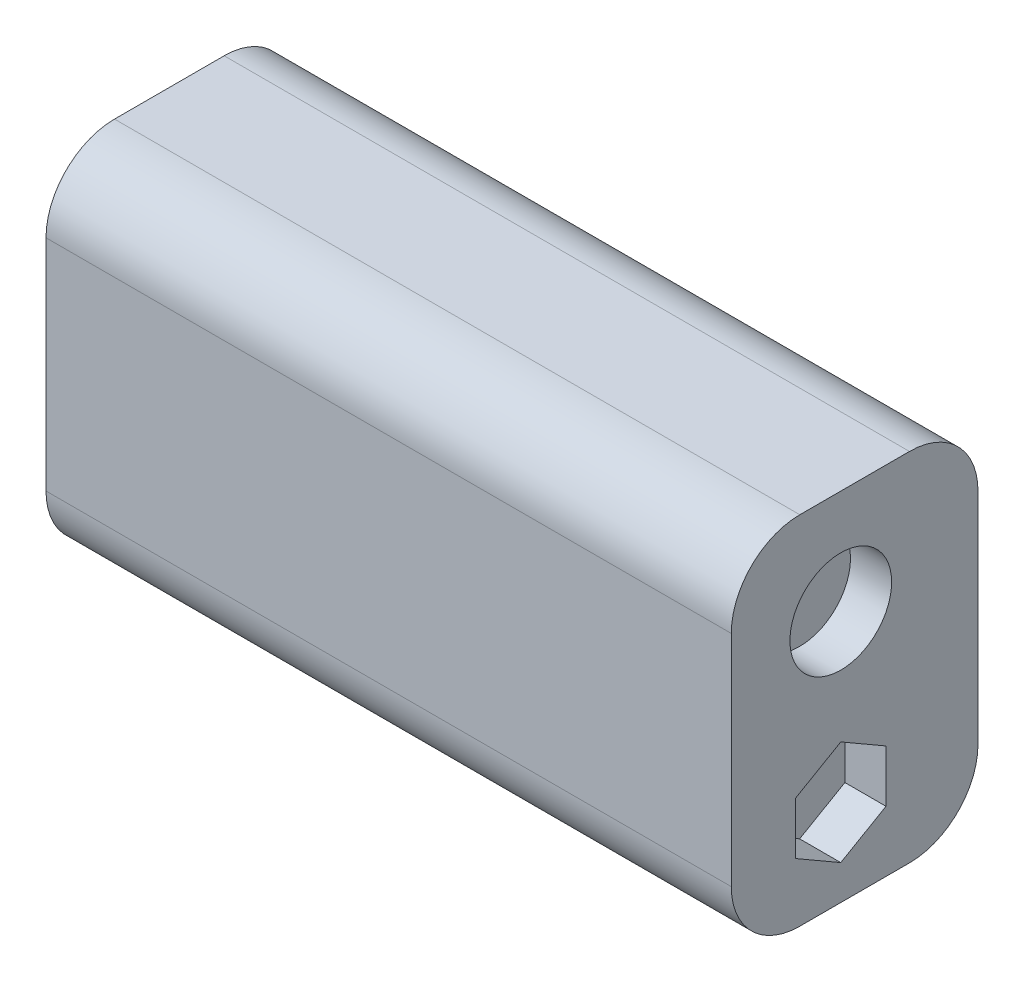
ISO-10303-21;
HEADER;
FILE_DESCRIPTION(('STEP AP214'),'2;1');
FILE_NAME('part.step','',(''),(''),'','','');
FILE_SCHEMA(('AUTOMOTIVE_DESIGN { 1 0 10303 214 1 1 1 1 }'));
ENDSEC;
DATA;
#1=APPLICATION_CONTEXT('core data for automotive mechanical design processes');
#2=APPLICATION_PROTOCOL_DEFINITION('international standard','automotive_design',2000,#1);
#3=PRODUCT_CONTEXT('',#1,'mechanical');
#4=PRODUCT('Part','Part','',(#3));
#5=PRODUCT_RELATED_PRODUCT_CATEGORY('part','',(#4));
#6=PRODUCT_DEFINITION_FORMATION('','',#4);
#7=PRODUCT_DEFINITION_CONTEXT('part definition',#1,'design');
#8=PRODUCT_DEFINITION('design','',#6,#7);
#9=PRODUCT_DEFINITION_SHAPE('','',#8);
#10=(LENGTH_UNIT() NAMED_UNIT(*) SI_UNIT(.MILLI.,.METRE.));
#11=(NAMED_UNIT(*) PLANE_ANGLE_UNIT() SI_UNIT($,.RADIAN.));
#12=(NAMED_UNIT(*) SI_UNIT($,.STERADIAN.) SOLID_ANGLE_UNIT());
#13=UNCERTAINTY_MEASURE_WITH_UNIT(LENGTH_MEASURE(1.E-05),#10,'distance_accuracy_value','');
#14=(GEOMETRIC_REPRESENTATION_CONTEXT(3) GLOBAL_UNCERTAINTY_ASSIGNED_CONTEXT((#13)) GLOBAL_UNIT_ASSIGNED_CONTEXT((#10,
#11,#12)) REPRESENTATION_CONTEXT('',''));
#15=CARTESIAN_POINT('',(0.,0.,0.));
#16=DIRECTION('',(0.,0.,1.));
#17=DIRECTION('',(1.,0.,0.));
#18=AXIS2_PLACEMENT_3D('',#15,#16,#17);
#19=CARTESIAN_POINT('',(-25.,-13.,18.));
#20=DIRECTION('',(1.,0.,0.));
#21=DIRECTION('',(0.,0.,-1.));
#22=AXIS2_PLACEMENT_3D('',#19,#20,#21);
#23=PLANE('',#22);
#24=DIRECTION('',(0.,0.,-1.));
#25=VECTOR('',#24,1.);
#26=CARTESIAN_POINT('',(-25.,-10.,0.));
#27=LINE('',#26,#25);
#28=CARTESIAN_POINT('',(-25.,-10.,7.));
#29=VERTEX_POINT('',#28);
#30=CARTESIAN_POINT('',(-25.,-10.,0.417424305044161));
#31=VERTEX_POINT('',#30);
#32=EDGE_CURVE('E176',#29,#31,#27,.T.);
#33=ORIENTED_EDGE('',*,*,#32,.T.);
#34=CARTESIAN_POINT('',(-25.,-8.,5.));
#35=DIRECTION('',(1.,0.,0.));
#36=DIRECTION('',(0.,0.,-1.));
#37=AXIS2_PLACEMENT_3D('',#34,#35,#36);
#38=CIRCLE('',#37,5.);
#39=CARTESIAN_POINT('',(-25.,-13.,5.));
#40=VERTEX_POINT('',#39);
#41=EDGE_CURVE('E299',#31,#40,#38,.F.);
#42=ORIENTED_EDGE('',*,*,#41,.T.);
#43=DIRECTION('',(0.,0.,-1.));
#44=VECTOR('',#43,1.);
#45=CARTESIAN_POINT('',(-25.,-13.,18.));
#46=LINE('',#45,#44);
#47=CARTESIAN_POINT('',(-25.,-13.,13.));
#48=VERTEX_POINT('',#47);
#49=EDGE_CURVE('E267',#48,#40,#46,.T.);
#50=ORIENTED_EDGE('',*,*,#49,.F.);
#51=CARTESIAN_POINT('',(-25.,-8.,13.));
#52=DIRECTION('',(1.,0.,0.));
#53=DIRECTION('',(0.,0.,-1.));
#54=AXIS2_PLACEMENT_3D('',#51,#52,#53);
#55=CIRCLE('',#54,5.);
#56=CARTESIAN_POINT('',(-25.,-8.,18.));
#57=VERTEX_POINT('',#56);
#58=EDGE_CURVE('E297',#48,#57,#55,.F.);
#59=ORIENTED_EDGE('',*,*,#58,.T.);
#60=DIRECTION('',(0.,-1.,0.));
#61=VECTOR('',#60,1.);
#62=CARTESIAN_POINT('',(-25.,-13.,18.));
#63=LINE('',#62,#61);
#64=CARTESIAN_POINT('',(-25.,7.99999999999999,18.));
#65=VERTEX_POINT('',#64);
#66=EDGE_CURVE('E256',#65,#57,#63,.T.);
#67=ORIENTED_EDGE('',*,*,#66,.F.);
#68=CARTESIAN_POINT('',(-25.,8.,13.));
#69=DIRECTION('',(1.,0.,0.));
#70=DIRECTION('',(0.,0.,-1.));
#71=AXIS2_PLACEMENT_3D('',#68,#69,#70);
#72=CIRCLE('',#71,5.);
#73=CARTESIAN_POINT('',(-25.,13.,13.));
#74=VERTEX_POINT('',#73);
#75=EDGE_CURVE('E294',#65,#74,#72,.F.);
#76=ORIENTED_EDGE('',*,*,#75,.T.);
#77=DIRECTION('',(0.,0.,-1.));
#78=VECTOR('',#77,1.);
#79=CARTESIAN_POINT('',(-25.,13.,18.));
#80=LINE('',#79,#78);
#81=CARTESIAN_POINT('',(-25.,13.,5.));
#82=VERTEX_POINT('',#81);
#83=EDGE_CURVE('E270',#74,#82,#80,.T.);
#84=ORIENTED_EDGE('',*,*,#83,.T.);
#85=CARTESIAN_POINT('',(-25.,8.,5.));
#86=DIRECTION('',(1.,0.,0.));
#87=DIRECTION('',(0.,0.,-1.));
#88=AXIS2_PLACEMENT_3D('',#85,#86,#87);
#89=CIRCLE('',#88,5.);
#90=CARTESIAN_POINT('',(-25.,7.99999999999999,0.));
#91=VERTEX_POINT('',#90);
#92=EDGE_CURVE('E58',#82,#91,#89,.F.);
#93=ORIENTED_EDGE('',*,*,#92,.T.);
#94=DIRECTION('',(0.,-1.,0.));
#95=VECTOR('',#94,1.);
#96=CARTESIAN_POINT('',(-25.,-13.,0.));
#97=LINE('',#96,#95);
#98=CARTESIAN_POINT('',(-25.,2.,0.));
#99=VERTEX_POINT('',#98);
#100=EDGE_CURVE('E257',#91,#99,#97,.T.);
#101=ORIENTED_EDGE('',*,*,#100,.T.);
#102=DIRECTION('',(0.,0.,-1.));
#103=VECTOR('',#102,1.);
#104=CARTESIAN_POINT('',(-25.,2.,0.));
#105=LINE('',#104,#103);
#106=CARTESIAN_POINT('',(-25.,2.,7.));
#107=VERTEX_POINT('',#106);
#108=EDGE_CURVE('E182',#107,#99,#105,.T.);
#109=ORIENTED_EDGE('',*,*,#108,.F.);
#110=DIRECTION('',(0.,-1.,0.));
#111=VECTOR('',#110,1.);
#112=CARTESIAN_POINT('',(-25.,0.,7.));
#113=LINE('',#112,#111);
#114=EDGE_CURVE('E184',#107,#29,#113,.T.);
#115=ORIENTED_EDGE('',*,*,#114,.T.);
#116=EDGE_LOOP('',(#33,#42,#50,#59,#67,#76,#84,#93,#101,#109,#115));
#117=FACE_BOUND('',#116,.T.);
#118=ADVANCED_FACE('F35',(#117),#23,.F.);
#119=CARTESIAN_POINT('',(-25.,-8.,5.));
#120=DIRECTION('',(-1.,0.,0.));
#121=DIRECTION('',(0.,0.,1.));
#122=AXIS2_PLACEMENT_3D('',#119,#120,#121);
#123=CYLINDRICAL_SURFACE('',#122,5.);
#124=ORIENTED_EDGE('',*,*,#41,.F.);
#125=DIRECTION('',(-1.,0.,0.));
#126=VECTOR('',#125,1.);
#127=CARTESIAN_POINT('',(-20.,-10.,0.417424305044161));
#128=LINE('',#127,#126);
#129=CARTESIAN_POINT('',(-20.,-10.,0.417424305044161));
#130=VERTEX_POINT('',#129);
#131=EDGE_CURVE('E192',#130,#31,#128,.T.);
#132=ORIENTED_EDGE('',*,*,#131,.F.);
#133=CARTESIAN_POINT('',(-20.,-8.,5.));
#134=DIRECTION('',(-1.,0.,0.));
#135=DIRECTION('',(0.,0.,1.));
#136=AXIS2_PLACEMENT_3D('',#133,#134,#135);
#137=CIRCLE('',#136,5.);
#138=CARTESIAN_POINT('',(-20.,-8.,0.));
#139=VERTEX_POINT('',#138);
#140=EDGE_CURVE('E178',#139,#130,#137,.T.);
#141=ORIENTED_EDGE('',*,*,#140,.F.);
#142=DIRECTION('',(1.,0.,0.));
#143=VECTOR('',#142,1.);
#144=CARTESIAN_POINT('',(-25.,-8.,0.));
#145=LINE('',#144,#143);
#146=CARTESIAN_POINT('',(25.,-8.,0.));
#147=VERTEX_POINT('',#146);
#148=EDGE_CURVE('E291',#147,#139,#145,.F.);
#149=ORIENTED_EDGE('',*,*,#148,.F.);
#150=CARTESIAN_POINT('',(25.,-8.,5.));
#151=DIRECTION('',(-1.,0.,0.));
#152=DIRECTION('',(0.,0.,1.));
#153=AXIS2_PLACEMENT_3D('',#150,#151,#152);
#154=CIRCLE('',#153,5.);
#155=CARTESIAN_POINT('',(25.,-13.,5.));
#156=VERTEX_POINT('',#155);
#157=EDGE_CURVE('E287',#156,#147,#154,.F.);
#158=ORIENTED_EDGE('',*,*,#157,.F.);
#159=DIRECTION('',(1.,0.,0.));
#160=VECTOR('',#159,1.);
#161=CARTESIAN_POINT('',(25.,-13.,5.));
#162=LINE('',#161,#160);
#163=EDGE_CURVE('E278',#40,#156,#162,.T.);
#164=ORIENTED_EDGE('',*,*,#163,.F.);
#165=EDGE_LOOP('',(#124,#132,#141,#149,#158,#164));
#166=FACE_BOUND('',#165,.T.);
#167=ADVANCED_FACE('F334',(#166),#123,.T.);
#168=CARTESIAN_POINT('',(25.,-13.,18.));
#169=DIRECTION('',(-1.,0.,0.));
#170=DIRECTION('',(0.,0.,1.));
#171=AXIS2_PLACEMENT_3D('',#168,#169,#170);
#172=PLANE('',#171);
#173=DIRECTION('',(0.,-0.500000000000001,0.866025403784438));
#174=VECTOR('',#173,1.);
#175=CARTESIAN_POINT('',(25.,-2.84865676001544,10.0124394191141));
#176=LINE('',#175,#174);
#177=CARTESIAN_POINT('',(25.,-2.84865676001545,10.0124394191141));
#178=VERTEX_POINT('',#177);
#179=CARTESIAN_POINT('',(25.,-4.75460978404386,13.3136468935709));
#180=VERTEX_POINT('',#179);
#181=EDGE_CURVE('E221',#178,#180,#176,.T.);
#182=ORIENTED_EDGE('',*,*,#181,.F.);
#183=DIRECTION('',(0.,0.499999999999995,0.866025403784441));
#184=VECTOR('',#183,1.);
#185=CARTESIAN_POINT('',(25.,-4.75460978404381,6.71123194465739));
#186=LINE('',#185,#184);
#187=CARTESIAN_POINT('',(25.,-4.75460978404381,6.71123194465739));
#188=VERTEX_POINT('',#187);
#189=EDGE_CURVE('E219',#188,#178,#186,.T.);
#190=ORIENTED_EDGE('',*,*,#189,.F.);
#191=DIRECTION('',(0.,1.,0.));
#192=VECTOR('',#191,1.);
#193=CARTESIAN_POINT('',(25.,-8.56651583210063,6.71123194465735));
#194=LINE('',#193,#192);
#195=CARTESIAN_POINT('',(25.,-8.56651583210063,6.71123194465735));
#196=VERTEX_POINT('',#195);
#197=EDGE_CURVE('E203',#196,#188,#194,.T.);
#198=ORIENTED_EDGE('',*,*,#197,.F.);
#199=DIRECTION('',(0.,0.500000000000007,-0.866025403784435));
#200=VECTOR('',#199,1.);
#201=CARTESIAN_POINT('',(25.,-10.4724688561291,10.0124394191141));
#202=LINE('',#201,#200);
#203=CARTESIAN_POINT('',(25.,-10.4724688561291,10.0124394191141));
#204=VERTEX_POINT('',#203);
#205=EDGE_CURVE('E231',#204,#196,#202,.T.);
#206=ORIENTED_EDGE('',*,*,#205,.F.);
#207=DIRECTION('',(0.,-0.499999999999995,-0.866025403784441));
#208=VECTOR('',#207,1.);
#209=CARTESIAN_POINT('',(25.,-8.56651583210068,13.3136468935709));
#210=LINE('',#209,#208);
#211=CARTESIAN_POINT('',(25.,-8.56651583210068,13.3136468935709));
#212=VERTEX_POINT('',#211);
#213=EDGE_CURVE('E228',#212,#204,#210,.T.);
#214=ORIENTED_EDGE('',*,*,#213,.F.);
#215=DIRECTION('',(0.,-1.,0.));
#216=VECTOR('',#215,1.);
#217=CARTESIAN_POINT('',(25.,-4.75460978404386,13.3136468935709));
#218=LINE('',#217,#216);
#219=EDGE_CURVE('E225',#180,#212,#218,.T.);
#220=ORIENTED_EDGE('',*,*,#219,.F.);
#221=EDGE_LOOP('',(#182,#190,#198,#206,#214,#220));
#222=FACE_BOUND('',#221,.T.);
#223=CARTESIAN_POINT('',(25.,5.39542606419019,10.0124394191141));
#224=DIRECTION('',(1.,0.,0.));
#225=DIRECTION('',(0.,0.,-1.));
#226=AXIS2_PLACEMENT_3D('',#223,#224,#225);
#227=CIRCLE('',#226,3.70982594623362);
#228=CARTESIAN_POINT('',(25.,5.39542606419019,6.3026134728805));
#229=VERTEX_POINT('',#228);
#230=EDGE_CURVE('E194',#229,#229,#227,.T.);
#231=ORIENTED_EDGE('',*,*,#230,.F.);
#232=EDGE_LOOP('',(#231));
#233=FACE_BOUND('',#232,.T.);
#234=DIRECTION('',(0.,0.,-1.));
#235=VECTOR('',#234,1.);
#236=CARTESIAN_POINT('',(25.,-13.,18.));
#237=LINE('',#236,#235);
#238=CARTESIAN_POINT('',(25.,-13.,13.));
#239=VERTEX_POINT('',#238);
#240=EDGE_CURVE('E260',#239,#156,#237,.T.);
#241=ORIENTED_EDGE('',*,*,#240,.T.);
#242=ORIENTED_EDGE('',*,*,#157,.T.);
#243=DIRECTION('',(0.,1.,0.));
#244=VECTOR('',#243,1.);
#245=CARTESIAN_POINT('',(25.,-13.,0.));
#246=LINE('',#245,#244);
#247=CARTESIAN_POINT('',(25.,7.99999999999999,0.));
#248=VERTEX_POINT('',#247);
#249=EDGE_CURVE('E238',#147,#248,#246,.T.);
#250=ORIENTED_EDGE('',*,*,#249,.T.);
#251=CARTESIAN_POINT('',(25.,8.,5.));
#252=DIRECTION('',(-1.,0.,0.));
#253=DIRECTION('',(0.,0.,1.));
#254=AXIS2_PLACEMENT_3D('',#251,#252,#253);
#255=CIRCLE('',#254,5.);
#256=CARTESIAN_POINT('',(25.,13.,5.));
#257=VERTEX_POINT('',#256);
#258=EDGE_CURVE('E283',#248,#257,#255,.F.);
#259=ORIENTED_EDGE('',*,*,#258,.T.);
#260=DIRECTION('',(0.,0.,-1.));
#261=VECTOR('',#260,1.);
#262=CARTESIAN_POINT('',(25.,13.,18.));
#263=LINE('',#262,#261);
#264=CARTESIAN_POINT('',(25.,13.,13.));
#265=VERTEX_POINT('',#264);
#266=EDGE_CURVE('E273',#265,#257,#263,.T.);
#267=ORIENTED_EDGE('',*,*,#266,.F.);
#268=CARTESIAN_POINT('',(25.,8.,13.));
#269=DIRECTION('',(-1.,0.,0.));
#270=DIRECTION('',(0.,0.,1.));
#271=AXIS2_PLACEMENT_3D('',#268,#269,#270);
#272=CIRCLE('',#271,5.);
#273=CARTESIAN_POINT('',(25.,7.99999999999999,18.));
#274=VERTEX_POINT('',#273);
#275=EDGE_CURVE('E281',#265,#274,#272,.F.);
#276=ORIENTED_EDGE('',*,*,#275,.T.);
#277=DIRECTION('',(0.,1.,0.));
#278=VECTOR('',#277,1.);
#279=CARTESIAN_POINT('',(25.,-13.,18.));
#280=LINE('',#279,#278);
#281=CARTESIAN_POINT('',(25.,-8.,18.));
#282=VERTEX_POINT('',#281);
#283=EDGE_CURVE('E253',#282,#274,#280,.T.);
#284=ORIENTED_EDGE('',*,*,#283,.F.);
#285=CARTESIAN_POINT('',(25.,-8.,13.));
#286=DIRECTION('',(-1.,0.,0.));
#287=DIRECTION('',(0.,0.,1.));
#288=AXIS2_PLACEMENT_3D('',#285,#286,#287);
#289=CIRCLE('',#288,5.);
#290=EDGE_CURVE('E285',#282,#239,#289,.F.);
#291=ORIENTED_EDGE('',*,*,#290,.T.);
#292=EDGE_LOOP('',(#241,#242,#250,#259,#267,#276,#284,#291));
#293=FACE_BOUND('',#292,.T.);
#294=ADVANCED_FACE('F314',(#222,#233,#293),#172,.F.);
#295=CARTESIAN_POINT('',(-25.,13.,18.));
#296=DIRECTION('',(0.,-1.,0.));
#297=DIRECTION('',(0.,0.,-1.));
#298=AXIS2_PLACEMENT_3D('',#295,#296,#297);
#299=PLANE('',#298);
#300=ORIENTED_EDGE('',*,*,#266,.T.);
#301=DIRECTION('',(-1.,0.,0.));
#302=VECTOR('',#301,1.);
#303=CARTESIAN_POINT('',(-25.,13.,5.));
#304=LINE('',#303,#302);
#305=EDGE_CURVE('E11',#257,#82,#304,.T.);
#306=ORIENTED_EDGE('',*,*,#305,.T.);
#307=ORIENTED_EDGE('',*,*,#83,.F.);
#308=DIRECTION('',(-1.,0.,0.));
#309=VECTOR('',#308,1.);
#310=CARTESIAN_POINT('',(-25.,13.,13.));
#311=LINE('',#310,#309);
#312=EDGE_CURVE('E43',#74,#265,#311,.F.);
#313=ORIENTED_EDGE('',*,*,#312,.T.);
#314=EDGE_LOOP('',(#300,#306,#307,#313));
#315=FACE_BOUND('',#314,.T.);
#316=ADVANCED_FACE('F310',(#315),#299,.F.);
#317=CARTESIAN_POINT('',(-25.,-13.,18.));
#318=DIRECTION('',(0.,1.,0.));
#319=DIRECTION('',(0.,0.,1.));
#320=AXIS2_PLACEMENT_3D('',#317,#318,#319);
#321=PLANE('',#320);
#322=ORIENTED_EDGE('',*,*,#49,.T.);
#323=ORIENTED_EDGE('',*,*,#163,.T.);
#324=ORIENTED_EDGE('',*,*,#240,.F.);
#325=DIRECTION('',(1.,0.,0.));
#326=VECTOR('',#325,1.);
#327=CARTESIAN_POINT('',(-25.,-13.,13.));
#328=LINE('',#327,#326);
#329=EDGE_CURVE('E276',#239,#48,#328,.F.);
#330=ORIENTED_EDGE('',*,*,#329,.T.);
#331=EDGE_LOOP('',(#322,#323,#324,#330));
#332=FACE_BOUND('',#331,.T.);
#333=ADVANCED_FACE('F330',(#332),#321,.F.);
#334=CARTESIAN_POINT('',(0.,0.,18.));
#335=DIRECTION('',(0.,0.,-1.));
#336=DIRECTION('',(-1.,0.,0.));
#337=AXIS2_PLACEMENT_3D('',#334,#335,#336);
#338=PLANE('',#337);
#339=ORIENTED_EDGE('',*,*,#66,.T.);
#340=DIRECTION('',(1.,0.,0.));
#341=VECTOR('',#340,1.);
#342=CARTESIAN_POINT('',(0.,-8.,18.));
#343=LINE('',#342,#341);
#344=EDGE_CURVE('E304',#57,#282,#343,.T.);
#345=ORIENTED_EDGE('',*,*,#344,.T.);
#346=ORIENTED_EDGE('',*,*,#283,.T.);
#347=DIRECTION('',(-1.,0.,0.));
#348=VECTOR('',#347,1.);
#349=CARTESIAN_POINT('',(0.,8.,18.));
#350=LINE('',#349,#348);
#351=EDGE_CURVE('E301',#274,#65,#350,.T.);
#352=ORIENTED_EDGE('',*,*,#351,.T.);
#353=EDGE_LOOP('',(#339,#345,#346,#352));
#354=FACE_BOUND('',#353,.T.);
#355=ADVANCED_FACE('F320',(#354),#338,.F.);
#356=CARTESIAN_POINT('',(0.,0.,0.));
#357=DIRECTION('',(0.,0.,-1.));
#358=DIRECTION('',(-1.,0.,0.));
#359=AXIS2_PLACEMENT_3D('',#356,#357,#358);
#360=PLANE('',#359);
#361=DIRECTION('',(-1.,0.,0.));
#362=VECTOR('',#361,1.);
#363=CARTESIAN_POINT('',(-20.,2.,0.));
#364=LINE('',#363,#362);
#365=CARTESIAN_POINT('',(-20.,2.,0.));
#366=VERTEX_POINT('',#365);
#367=EDGE_CURVE('E195',#366,#99,#364,.T.);
#368=ORIENTED_EDGE('',*,*,#367,.T.);
#369=ORIENTED_EDGE('',*,*,#100,.F.);
#370=DIRECTION('',(-1.,0.,0.));
#371=VECTOR('',#370,1.);
#372=CARTESIAN_POINT('',(25.,8.,0.));
#373=LINE('',#372,#371);
#374=EDGE_CURVE('E289',#91,#248,#373,.F.);
#375=ORIENTED_EDGE('',*,*,#374,.T.);
#376=ORIENTED_EDGE('',*,*,#249,.F.);
#377=ORIENTED_EDGE('',*,*,#148,.T.);
#378=DIRECTION('',(0.,-1.,0.));
#379=VECTOR('',#378,1.);
#380=CARTESIAN_POINT('',(-20.,0.,0.));
#381=LINE('',#380,#379);
#382=EDGE_CURVE('E50',#366,#139,#381,.T.);
#383=ORIENTED_EDGE('',*,*,#382,.F.);
#384=EDGE_LOOP('',(#368,#369,#375,#376,#377,#383));
#385=FACE_BOUND('',#384,.T.);
#386=ADVANCED_FACE('F338',(#385),#360,.T.);
#387=CARTESIAN_POINT('',(22.,5.39542606419019,10.0124394191141));
#388=DIRECTION('',(1.,0.,0.));
#389=DIRECTION('',(0.,0.,-1.));
#390=AXIS2_PLACEMENT_3D('',#387,#388,#389);
#391=CYLINDRICAL_SURFACE('',#390,3.70982594623362);
#392=CARTESIAN_POINT('',(22.,5.39542606419019,10.0124394191141));
#393=DIRECTION('',(1.,0.,0.));
#394=DIRECTION('',(0.,0.,-1.));
#395=AXIS2_PLACEMENT_3D('',#392,#393,#394);
#396=CIRCLE('',#395,3.70982594623362);
#397=CARTESIAN_POINT('',(22.,5.39542606419019,6.3026134728805));
#398=VERTEX_POINT('',#397);
#399=EDGE_CURVE('E222',#398,#398,#396,.T.);
#400=ORIENTED_EDGE('',*,*,#399,.F.);
#401=EDGE_LOOP('',(#400));
#402=FACE_BOUND('',#401,.T.);
#403=ORIENTED_EDGE('',*,*,#230,.T.);
#404=EDGE_LOOP('',(#403));
#405=FACE_BOUND('',#404,.T.);
#406=ADVANCED_FACE('F412',(#402,#405),#391,.F.);
#407=CARTESIAN_POINT('',(22.,5.39542606419019,10.0124394191141));
#408=DIRECTION('',(1.,0.,0.));
#409=DIRECTION('',(0.,0.,-1.));
#410=AXIS2_PLACEMENT_3D('',#407,#408,#409);
#411=PLANE('',#410);
#412=ORIENTED_EDGE('',*,*,#399,.T.);
#413=EDGE_LOOP('',(#412));
#414=FACE_BOUND('',#413,.T.);
#415=ADVANCED_FACE('F511',(#414),#411,.T.);
#416=CARTESIAN_POINT('',(22.,-4.75460978404381,6.71123194465739));
#417=DIRECTION('',(0.,0.866025403784442,-0.499999999999995));
#418=DIRECTION('',(0.,0.499999999999995,0.866025403784442));
#419=AXIS2_PLACEMENT_3D('',#416,#417,#418);
#420=PLANE('',#419);
#421=ORIENTED_EDGE('',*,*,#189,.T.);
#422=DIRECTION('',(1.,0.,0.));
#423=VECTOR('',#422,1.);
#424=CARTESIAN_POINT('',(22.,-2.84865676001544,10.0124394191141));
#425=LINE('',#424,#423);
#426=CARTESIAN_POINT('',(22.,-2.84865676001544,10.0124394191141));
#427=VERTEX_POINT('',#426);
#428=EDGE_CURVE('E218',#427,#178,#425,.T.);
#429=ORIENTED_EDGE('',*,*,#428,.F.);
#430=DIRECTION('',(0.,0.499999999999995,0.866025403784441));
#431=VECTOR('',#430,1.);
#432=CARTESIAN_POINT('',(22.,-4.75460978404381,6.71123194465739));
#433=LINE('',#432,#431);
#434=CARTESIAN_POINT('',(22.,-4.75460978404381,6.71123194465739));
#435=VERTEX_POINT('',#434);
#436=EDGE_CURVE('E199',#435,#427,#433,.T.);
#437=ORIENTED_EDGE('',*,*,#436,.F.);
#438=DIRECTION('',(1.,0.,0.));
#439=VECTOR('',#438,1.);
#440=CARTESIAN_POINT('',(22.,-4.75460978404381,6.71123194465739));
#441=LINE('',#440,#439);
#442=EDGE_CURVE('E236',#435,#188,#441,.T.);
#443=ORIENTED_EDGE('',*,*,#442,.T.);
#444=EDGE_LOOP('',(#421,#429,#437,#443));
#445=FACE_BOUND('',#444,.T.);
#446=ADVANCED_FACE('F503',(#445),#420,.F.);
#447=CARTESIAN_POINT('',(22.,-8.56651583210063,6.71123194465735));
#448=DIRECTION('',(0.,0.,-1.));
#449=DIRECTION('',(0.,1.,0.));
#450=AXIS2_PLACEMENT_3D('',#447,#448,#449);
#451=PLANE('',#450);
#452=ORIENTED_EDGE('',*,*,#197,.T.);
#453=ORIENTED_EDGE('',*,*,#442,.F.);
#454=DIRECTION('',(0.,1.,0.));
#455=VECTOR('',#454,1.);
#456=CARTESIAN_POINT('',(22.,-8.56651583210063,6.71123194465735));
#457=LINE('',#456,#455);
#458=CARTESIAN_POINT('',(22.,-8.56651583210063,6.71123194465735));
#459=VERTEX_POINT('',#458);
#460=EDGE_CURVE('E215',#459,#435,#457,.T.);
#461=ORIENTED_EDGE('',*,*,#460,.F.);
#462=DIRECTION('',(1.,0.,0.));
#463=VECTOR('',#462,1.);
#464=CARTESIAN_POINT('',(22.,-8.56651583210063,6.71123194465735));
#465=LINE('',#464,#463);
#466=EDGE_CURVE('E239',#459,#196,#465,.T.);
#467=ORIENTED_EDGE('',*,*,#466,.T.);
#468=EDGE_LOOP('',(#452,#453,#461,#467));
#469=FACE_BOUND('',#468,.T.);
#470=ADVANCED_FACE('F495',(#469),#451,.F.);
#471=CARTESIAN_POINT('',(22.,-10.4724688561291,10.0124394191141));
#472=DIRECTION('',(0.,-0.866025403784434,-0.500000000000007));
#473=DIRECTION('',(0.,0.500000000000007,-0.866025403784435));
#474=AXIS2_PLACEMENT_3D('',#471,#472,#473);
#475=PLANE('',#474);
#476=ORIENTED_EDGE('',*,*,#205,.T.);
#477=ORIENTED_EDGE('',*,*,#466,.F.);
#478=DIRECTION('',(0.,0.500000000000007,-0.866025403784435));
#479=VECTOR('',#478,1.);
#480=CARTESIAN_POINT('',(22.,-10.4724688561291,10.0124394191141));
#481=LINE('',#480,#479);
#482=CARTESIAN_POINT('',(22.,-10.4724688561291,10.0124394191141));
#483=VERTEX_POINT('',#482);
#484=EDGE_CURVE('E212',#483,#459,#481,.T.);
#485=ORIENTED_EDGE('',*,*,#484,.F.);
#486=DIRECTION('',(1.,0.,0.));
#487=VECTOR('',#486,1.);
#488=CARTESIAN_POINT('',(22.,-10.4724688561291,10.0124394191141));
#489=LINE('',#488,#487);
#490=EDGE_CURVE('E241',#483,#204,#489,.T.);
#491=ORIENTED_EDGE('',*,*,#490,.T.);
#492=EDGE_LOOP('',(#476,#477,#485,#491));
#493=FACE_BOUND('',#492,.T.);
#494=ADVANCED_FACE('F487',(#493),#475,.F.);
#495=CARTESIAN_POINT('',(22.,-8.56651583210068,13.3136468935709));
#496=DIRECTION('',(0.,-0.866025403784441,0.499999999999995));
#497=DIRECTION('',(0.,-0.499999999999995,-0.866025403784441));
#498=AXIS2_PLACEMENT_3D('',#495,#496,#497);
#499=PLANE('',#498);
#500=ORIENTED_EDGE('',*,*,#213,.T.);
#501=ORIENTED_EDGE('',*,*,#490,.F.);
#502=DIRECTION('',(0.,-0.499999999999995,-0.866025403784441));
#503=VECTOR('',#502,1.);
#504=CARTESIAN_POINT('',(22.,-8.56651583210068,13.3136468935709));
#505=LINE('',#504,#503);
#506=CARTESIAN_POINT('',(22.,-8.56651583210068,13.3136468935709));
#507=VERTEX_POINT('',#506);
#508=EDGE_CURVE('E209',#507,#483,#505,.T.);
#509=ORIENTED_EDGE('',*,*,#508,.F.);
#510=DIRECTION('',(1.,0.,0.));
#511=VECTOR('',#510,1.);
#512=CARTESIAN_POINT('',(22.,-8.56651583210068,13.3136468935709));
#513=LINE('',#512,#511);
#514=EDGE_CURVE('E243',#507,#212,#513,.T.);
#515=ORIENTED_EDGE('',*,*,#514,.T.);
#516=EDGE_LOOP('',(#500,#501,#509,#515));
#517=FACE_BOUND('',#516,.T.);
#518=ADVANCED_FACE('F479',(#517),#499,.F.);
#519=CARTESIAN_POINT('',(22.,-4.75460978404386,13.3136468935709));
#520=DIRECTION('',(0.,0.,1.));
#521=DIRECTION('',(0.,-1.,0.));
#522=AXIS2_PLACEMENT_3D('',#519,#520,#521);
#523=PLANE('',#522);
#524=ORIENTED_EDGE('',*,*,#219,.T.);
#525=ORIENTED_EDGE('',*,*,#514,.F.);
#526=DIRECTION('',(0.,-1.,0.));
#527=VECTOR('',#526,1.);
#528=CARTESIAN_POINT('',(22.,-4.75460978404386,13.3136468935709));
#529=LINE('',#528,#527);
#530=CARTESIAN_POINT('',(22.,-4.75460978404386,13.3136468935709));
#531=VERTEX_POINT('',#530);
#532=EDGE_CURVE('E206',#531,#507,#529,.T.);
#533=ORIENTED_EDGE('',*,*,#532,.F.);
#534=DIRECTION('',(1.,0.,0.));
#535=VECTOR('',#534,1.);
#536=CARTESIAN_POINT('',(22.,-4.75460978404386,13.3136468935709));
#537=LINE('',#536,#535);
#538=EDGE_CURVE('E245',#531,#180,#537,.T.);
#539=ORIENTED_EDGE('',*,*,#538,.T.);
#540=EDGE_LOOP('',(#524,#525,#533,#539));
#541=FACE_BOUND('',#540,.T.);
#542=ADVANCED_FACE('F471',(#541),#523,.F.);
#543=CARTESIAN_POINT('',(22.,-2.84865676001544,10.0124394191141));
#544=DIRECTION('',(0.,0.866025403784438,0.500000000000001));
#545=DIRECTION('',(0.,-0.500000000000001,0.866025403784438));
#546=AXIS2_PLACEMENT_3D('',#543,#544,#545);
#547=PLANE('',#546);
#548=ORIENTED_EDGE('',*,*,#181,.T.);
#549=ORIENTED_EDGE('',*,*,#538,.F.);
#550=DIRECTION('',(0.,-0.500000000000001,0.866025403784438));
#551=VECTOR('',#550,1.);
#552=CARTESIAN_POINT('',(22.,-2.84865676001544,10.0124394191141));
#553=LINE('',#552,#551);
#554=EDGE_CURVE('E202',#427,#531,#553,.T.);
#555=ORIENTED_EDGE('',*,*,#554,.F.);
#556=ORIENTED_EDGE('',*,*,#428,.T.);
#557=EDGE_LOOP('',(#548,#549,#555,#556));
#558=FACE_BOUND('',#557,.T.);
#559=ADVANCED_FACE('F464',(#558),#547,.F.);
#560=CARTESIAN_POINT('',(22.,0.,0.));
#561=DIRECTION('',(1.,0.,0.));
#562=DIRECTION('',(0.,0.,-1.));
#563=AXIS2_PLACEMENT_3D('',#560,#561,#562);
#564=PLANE('',#563);
#565=ORIENTED_EDGE('',*,*,#436,.T.);
#566=ORIENTED_EDGE('',*,*,#554,.T.);
#567=ORIENTED_EDGE('',*,*,#532,.T.);
#568=ORIENTED_EDGE('',*,*,#508,.T.);
#569=ORIENTED_EDGE('',*,*,#484,.T.);
#570=ORIENTED_EDGE('',*,*,#460,.T.);
#571=EDGE_LOOP('',(#565,#566,#567,#568,#569,#570));
#572=FACE_BOUND('',#571,.T.);
#573=ADVANCED_FACE('F368',(#572),#564,.T.);
#574=CARTESIAN_POINT('',(0.,-8.,13.));
#575=DIRECTION('',(1.,0.,0.));
#576=DIRECTION('',(0.,0.,-1.));
#577=AXIS2_PLACEMENT_3D('',#574,#575,#576);
#578=CYLINDRICAL_SURFACE('',#577,5.);
#579=ORIENTED_EDGE('',*,*,#58,.F.);
#580=ORIENTED_EDGE('',*,*,#329,.F.);
#581=ORIENTED_EDGE('',*,*,#290,.F.);
#582=ORIENTED_EDGE('',*,*,#344,.F.);
#583=EDGE_LOOP('',(#579,#580,#581,#582));
#584=FACE_BOUND('',#583,.T.);
#585=ADVANCED_FACE('F327',(#584),#578,.T.);
#586=CARTESIAN_POINT('',(-25.,8.,5.));
#587=DIRECTION('',(1.,0.,0.));
#588=DIRECTION('',(0.,0.,-1.));
#589=AXIS2_PLACEMENT_3D('',#586,#587,#588);
#590=CYLINDRICAL_SURFACE('',#589,5.);
#591=ORIENTED_EDGE('',*,*,#258,.F.);
#592=ORIENTED_EDGE('',*,*,#374,.F.);
#593=ORIENTED_EDGE('',*,*,#92,.F.);
#594=ORIENTED_EDGE('',*,*,#305,.F.);
#595=EDGE_LOOP('',(#591,#592,#593,#594));
#596=FACE_BOUND('',#595,.T.);
#597=ADVANCED_FACE('F340',(#596),#590,.T.);
#598=CARTESIAN_POINT('',(0.,8.,13.));
#599=DIRECTION('',(-1.,0.,0.));
#600=DIRECTION('',(0.,0.,1.));
#601=AXIS2_PLACEMENT_3D('',#598,#599,#600);
#602=CYLINDRICAL_SURFACE('',#601,5.);
#603=ORIENTED_EDGE('',*,*,#275,.F.);
#604=ORIENTED_EDGE('',*,*,#312,.F.);
#605=ORIENTED_EDGE('',*,*,#75,.F.);
#606=ORIENTED_EDGE('',*,*,#351,.F.);
#607=EDGE_LOOP('',(#603,#604,#605,#606));
#608=FACE_BOUND('',#607,.T.);
#609=ADVANCED_FACE('F37',(#608),#602,.T.);
#610=CARTESIAN_POINT('',(-20.,-10.,0.));
#611=DIRECTION('',(0.,1.,0.));
#612=DIRECTION('',(0.,0.,1.));
#613=AXIS2_PLACEMENT_3D('',#610,#611,#612);
#614=PLANE('',#613);
#615=ORIENTED_EDGE('',*,*,#32,.F.);
#616=DIRECTION('',(-1.,0.,0.));
#617=VECTOR('',#616,1.);
#618=CARTESIAN_POINT('',(-20.,-10.,7.));
#619=LINE('',#618,#617);
#620=CARTESIAN_POINT('',(-20.,-10.,7.));
#621=VERTEX_POINT('',#620);
#622=EDGE_CURVE('E165',#621,#29,#619,.T.);
#623=ORIENTED_EDGE('',*,*,#622,.F.);
#624=DIRECTION('',(0.,0.,-1.));
#625=VECTOR('',#624,1.);
#626=CARTESIAN_POINT('',(-20.,-10.,0.));
#627=LINE('',#626,#625);
#628=EDGE_CURVE('E171',#621,#130,#627,.T.);
#629=ORIENTED_EDGE('',*,*,#628,.T.);
#630=ORIENTED_EDGE('',*,*,#131,.T.);
#631=EDGE_LOOP('',(#615,#623,#629,#630));
#632=FACE_BOUND('',#631,.T.);
#633=ADVANCED_FACE('F174',(#632),#614,.T.);
#634=CARTESIAN_POINT('',(-20.,2.,0.));
#635=DIRECTION('',(0.,1.,0.));
#636=DIRECTION('',(0.,0.,1.));
#637=AXIS2_PLACEMENT_3D('',#634,#635,#636);
#638=PLANE('',#637);
#639=ORIENTED_EDGE('',*,*,#108,.T.);
#640=ORIENTED_EDGE('',*,*,#367,.F.);
#641=DIRECTION('',(0.,0.,-1.));
#642=VECTOR('',#641,1.);
#643=CARTESIAN_POINT('',(-20.,2.,0.));
#644=LINE('',#643,#642);
#645=CARTESIAN_POINT('',(-20.,2.,7.));
#646=VERTEX_POINT('',#645);
#647=EDGE_CURVE('E170',#646,#366,#644,.T.);
#648=ORIENTED_EDGE('',*,*,#647,.F.);
#649=DIRECTION('',(-1.,0.,0.));
#650=VECTOR('',#649,1.);
#651=CARTESIAN_POINT('',(-20.,2.,7.));
#652=LINE('',#651,#650);
#653=EDGE_CURVE('E167',#646,#107,#652,.T.);
#654=ORIENTED_EDGE('',*,*,#653,.T.);
#655=EDGE_LOOP('',(#639,#640,#648,#654));
#656=FACE_BOUND('',#655,.T.);
#657=ADVANCED_FACE('F343',(#656),#638,.F.);
#658=CARTESIAN_POINT('',(-20.,0.,7.));
#659=DIRECTION('',(0.,0.,-1.));
#660=DIRECTION('',(-1.,0.,0.));
#661=AXIS2_PLACEMENT_3D('',#658,#659,#660);
#662=PLANE('',#661);
#663=ORIENTED_EDGE('',*,*,#114,.F.);
#664=ORIENTED_EDGE('',*,*,#653,.F.);
#665=DIRECTION('',(0.,-1.,0.));
#666=VECTOR('',#665,1.);
#667=CARTESIAN_POINT('',(-20.,0.,7.));
#668=LINE('',#667,#666);
#669=EDGE_CURVE('E161',#646,#621,#668,.T.);
#670=ORIENTED_EDGE('',*,*,#669,.T.);
#671=ORIENTED_EDGE('',*,*,#622,.T.);
#672=EDGE_LOOP('',(#663,#664,#670,#671));
#673=FACE_BOUND('',#672,.T.);
#674=ADVANCED_FACE('F164',(#673),#662,.T.);
#675=CARTESIAN_POINT('',(-20.,0.,0.));
#676=DIRECTION('',(-1.,0.,0.));
#677=DIRECTION('',(0.,0.,1.));
#678=AXIS2_PLACEMENT_3D('',#675,#676,#677);
#679=PLANE('',#678);
#680=ORIENTED_EDGE('',*,*,#628,.F.);
#681=ORIENTED_EDGE('',*,*,#669,.F.);
#682=ORIENTED_EDGE('',*,*,#647,.T.);
#683=ORIENTED_EDGE('',*,*,#382,.T.);
#684=ORIENTED_EDGE('',*,*,#140,.T.);
#685=EDGE_LOOP('',(#680,#681,#682,#683,#684));
#686=FACE_BOUND('',#685,.T.);
#687=ADVANCED_FACE('F180',(#686),#679,.T.);
#688=CLOSED_SHELL('',(#118,#167,#294,#316,#333,#355,#386,#406,#415,#446,#470,#494,#518,#542,
#559,#573,#585,#597,#609,#633,#657,#674,#687));
#689=MANIFOLD_SOLID_BREP('B2',#688);
#690=ADVANCED_BREP_SHAPE_REPRESENTATION('',(#18,#689),#14);
#691=SHAPE_DEFINITION_REPRESENTATION(#9,#690);
ENDSEC;
END-ISO-10303-21;
